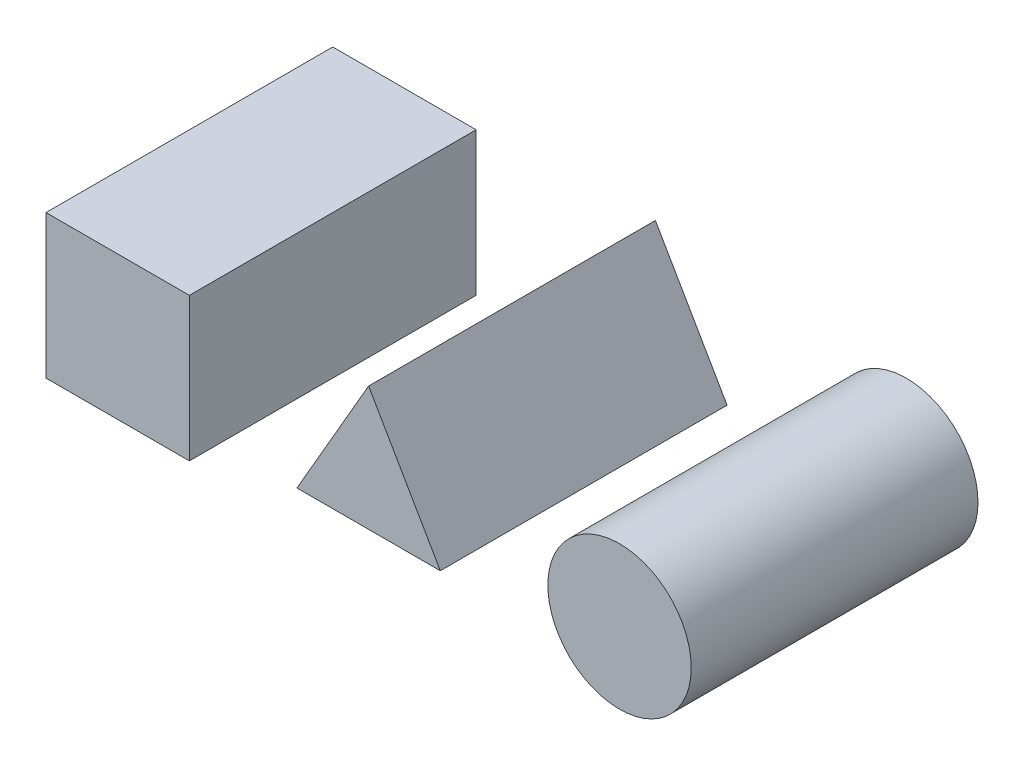
ISO-10303-21;
HEADER;
FILE_DESCRIPTION(('STEP AP214'),'2;1');
FILE_NAME('part.step','',(''),(''),'','','');
FILE_SCHEMA(('AUTOMOTIVE_DESIGN { 1 0 10303 214 1 1 1 1 }'));
ENDSEC;
DATA;
#1=APPLICATION_CONTEXT('core data for automotive mechanical design processes');
#2=APPLICATION_PROTOCOL_DEFINITION('international standard','automotive_design',2000,#1);
#3=PRODUCT_CONTEXT('',#1,'mechanical');
#4=PRODUCT('Part','Part','',(#3));
#5=PRODUCT_RELATED_PRODUCT_CATEGORY('part','',(#4));
#6=PRODUCT_DEFINITION_FORMATION('','',#4);
#7=PRODUCT_DEFINITION_CONTEXT('part definition',#1,'design');
#8=PRODUCT_DEFINITION('design','',#6,#7);
#9=PRODUCT_DEFINITION_SHAPE('','',#8);
#10=(LENGTH_UNIT() NAMED_UNIT(*) SI_UNIT(.MILLI.,.METRE.));
#11=(NAMED_UNIT(*) PLANE_ANGLE_UNIT() SI_UNIT($,.RADIAN.));
#12=(NAMED_UNIT(*) SI_UNIT($,.STERADIAN.) SOLID_ANGLE_UNIT());
#13=UNCERTAINTY_MEASURE_WITH_UNIT(LENGTH_MEASURE(1.E-05),#10,'distance_accuracy_value','');
#14=(GEOMETRIC_REPRESENTATION_CONTEXT(3) GLOBAL_UNCERTAINTY_ASSIGNED_CONTEXT((#13)) GLOBAL_UNIT_ASSIGNED_CONTEXT((#10,
#11,#12)) REPRESENTATION_CONTEXT('',''));
#15=CARTESIAN_POINT('',(0.,0.,0.));
#16=DIRECTION('',(0.,0.,1.));
#17=DIRECTION('',(1.,0.,0.));
#18=AXIS2_PLACEMENT_3D('',#15,#16,#17);
#19=CARTESIAN_POINT('',(70.,0.,80.));
#20=DIRECTION('',(0.,0.,-1.));
#21=DIRECTION('',(-1.,0.,0.));
#22=AXIS2_PLACEMENT_3D('',#19,#20,#21);
#23=CYLINDRICAL_SURFACE('',#22,20.);
#24=CARTESIAN_POINT('',(70.,0.,80.));
#25=DIRECTION('',(0.,0.,1.));
#26=DIRECTION('',(1.,0.,0.));
#27=AXIS2_PLACEMENT_3D('',#24,#25,#26);
#28=CIRCLE('',#27,20.);
#29=CARTESIAN_POINT('',(90.,0.,80.));
#30=VERTEX_POINT('',#29);
#31=EDGE_CURVE('E11',#30,#30,#28,.T.);
#32=ORIENTED_EDGE('',*,*,#31,.F.);
#33=EDGE_LOOP('',(#32));
#34=FACE_BOUND('',#33,.T.);
#35=CARTESIAN_POINT('',(70.,0.,0.));
#36=DIRECTION('',(0.,0.,1.));
#37=DIRECTION('',(1.,0.,0.));
#38=AXIS2_PLACEMENT_3D('',#35,#36,#37);
#39=CIRCLE('',#38,20.);
#40=CARTESIAN_POINT('',(90.,0.,0.));
#41=VERTEX_POINT('',#40);
#42=EDGE_CURVE('E53',#41,#41,#39,.T.);
#43=ORIENTED_EDGE('',*,*,#42,.T.);
#44=EDGE_LOOP('',(#43));
#45=FACE_BOUND('',#44,.T.);
#46=ADVANCED_FACE('F50',(#34,#45),#23,.T.);
#47=CARTESIAN_POINT('',(0.,0.,80.));
#48=DIRECTION('',(0.,0.,1.));
#49=DIRECTION('',(1.,0.,0.));
#50=AXIS2_PLACEMENT_3D('',#47,#48,#49);
#51=PLANE('',#50);
#52=ORIENTED_EDGE('',*,*,#31,.T.);
#53=EDGE_LOOP('',(#52));
#54=FACE_BOUND('',#53,.T.);
#55=ADVANCED_FACE('F65',(#54),#51,.T.);
#56=CARTESIAN_POINT('',(0.,0.,0.));
#57=DIRECTION('',(0.,0.,1.));
#58=DIRECTION('',(1.,0.,0.));
#59=AXIS2_PLACEMENT_3D('',#56,#57,#58);
#60=PLANE('',#59);
#61=ORIENTED_EDGE('',*,*,#42,.F.);
#62=EDGE_LOOP('',(#61));
#63=FACE_BOUND('',#62,.T.);
#64=ADVANCED_FACE('F63',(#63),#60,.F.);
#65=CLOSED_SHELL('',(#46,#55,#64));
#66=MANIFOLD_SOLID_BREP('B2',#65);
#67=CARTESIAN_POINT('',(-50.,0.,80.));
#68=DIRECTION('',(1.,0.,0.));
#69=DIRECTION('',(0.,1.,0.));
#70=AXIS2_PLACEMENT_3D('',#67,#68,#69);
#71=PLANE('',#70);
#72=DIRECTION('',(0.,-1.,0.));
#73=VECTOR('',#72,1.);
#74=CARTESIAN_POINT('',(-50.,0.,0.));
#75=LINE('',#74,#73);
#76=CARTESIAN_POINT('',(-50.,19.9999999999999,0.));
#77=VERTEX_POINT('',#76);
#78=CARTESIAN_POINT('',(-49.9999999999999,-20.0000000000001,0.));
#79=VERTEX_POINT('',#78);
#80=EDGE_CURVE('E169',#77,#79,#75,.T.);
#81=ORIENTED_EDGE('',*,*,#80,.F.);
#82=DIRECTION('',(0.,0.,-1.));
#83=VECTOR('',#82,1.);
#84=CARTESIAN_POINT('',(-50.,19.9999999999999,80.));
#85=LINE('',#84,#83);
#86=CARTESIAN_POINT('',(-50.,19.9999999999999,80.));
#87=VERTEX_POINT('',#86);
#88=EDGE_CURVE('E48',#87,#77,#85,.T.);
#89=ORIENTED_EDGE('',*,*,#88,.F.);
#90=DIRECTION('',(0.,-1.,0.));
#91=VECTOR('',#90,1.);
#92=CARTESIAN_POINT('',(-50.,0.,80.));
#93=LINE('',#92,#91);
#94=CARTESIAN_POINT('',(-49.9999999999999,-20.0000000000001,80.));
#95=VERTEX_POINT('',#94);
#96=EDGE_CURVE('E160',#87,#95,#93,.T.);
#97=ORIENTED_EDGE('',*,*,#96,.T.);
#98=DIRECTION('',(0.,0.,-1.));
#99=VECTOR('',#98,1.);
#100=CARTESIAN_POINT('',(-49.9999999999999,-20.0000000000001,80.));
#101=LINE('',#100,#99);
#102=EDGE_CURVE('E139',#95,#79,#101,.T.);
#103=ORIENTED_EDGE('',*,*,#102,.T.);
#104=EDGE_LOOP('',(#81,#89,#97,#103));
#105=FACE_BOUND('',#104,.T.);
#106=ADVANCED_FACE('F100',(#105),#71,.T.);
#107=CARTESIAN_POINT('',(0.,20.,80.));
#108=DIRECTION('',(0.,1.,0.));
#109=DIRECTION('',(-1.,0.,0.));
#110=AXIS2_PLACEMENT_3D('',#107,#108,#109);
#111=PLANE('',#110);
#112=DIRECTION('',(1.,0.,0.));
#113=VECTOR('',#112,1.);
#114=CARTESIAN_POINT('',(0.,20.,0.));
#115=LINE('',#114,#113);
#116=CARTESIAN_POINT('',(-90.,19.9999999999999,0.));
#117=VERTEX_POINT('',#116);
#118=EDGE_CURVE('E152',#117,#77,#115,.T.);
#119=ORIENTED_EDGE('',*,*,#118,.F.);
#120=DIRECTION('',(0.,0.,-1.));
#121=VECTOR('',#120,1.);
#122=CARTESIAN_POINT('',(-90.,19.9999999999999,80.));
#123=LINE('',#122,#121);
#124=CARTESIAN_POINT('',(-90.,19.9999999999999,80.));
#125=VERTEX_POINT('',#124);
#126=EDGE_CURVE('E109',#125,#117,#123,.T.);
#127=ORIENTED_EDGE('',*,*,#126,.F.);
#128=DIRECTION('',(1.,0.,0.));
#129=VECTOR('',#128,1.);
#130=CARTESIAN_POINT('',(0.,20.,80.));
#131=LINE('',#130,#129);
#132=EDGE_CURVE('E150',#125,#87,#131,.T.);
#133=ORIENTED_EDGE('',*,*,#132,.T.);
#134=ORIENTED_EDGE('',*,*,#88,.T.);
#135=EDGE_LOOP('',(#119,#127,#133,#134));
#136=FACE_BOUND('',#135,.T.);
#137=ADVANCED_FACE('F148',(#136),#111,.T.);
#138=CARTESIAN_POINT('',(-90.,0.,80.));
#139=DIRECTION('',(1.,0.,0.));
#140=DIRECTION('',(0.,1.,0.));
#141=AXIS2_PLACEMENT_3D('',#138,#139,#140);
#142=PLANE('',#141);
#143=DIRECTION('',(0.,-1.,0.));
#144=VECTOR('',#143,1.);
#145=CARTESIAN_POINT('',(-90.,0.,0.));
#146=LINE('',#145,#144);
#147=CARTESIAN_POINT('',(-89.9999999999999,-20.0000000000001,0.));
#148=VERTEX_POINT('',#147);
#149=EDGE_CURVE('E132',#117,#148,#146,.T.);
#150=ORIENTED_EDGE('',*,*,#149,.T.);
#151=DIRECTION('',(0.,0.,-1.));
#152=VECTOR('',#151,1.);
#153=CARTESIAN_POINT('',(-89.9999999999999,-20.0000000000001,80.));
#154=LINE('',#153,#152);
#155=CARTESIAN_POINT('',(-89.9999999999999,-20.0000000000001,80.));
#156=VERTEX_POINT('',#155);
#157=EDGE_CURVE('E154',#156,#148,#154,.T.);
#158=ORIENTED_EDGE('',*,*,#157,.F.);
#159=DIRECTION('',(0.,-1.,0.));
#160=VECTOR('',#159,1.);
#161=CARTESIAN_POINT('',(-90.,0.,80.));
#162=LINE('',#161,#160);
#163=EDGE_CURVE('E155',#125,#156,#162,.T.);
#164=ORIENTED_EDGE('',*,*,#163,.F.);
#165=ORIENTED_EDGE('',*,*,#126,.T.);
#166=EDGE_LOOP('',(#150,#158,#164,#165));
#167=FACE_BOUND('',#166,.T.);
#168=ADVANCED_FACE('F156',(#167),#142,.F.);
#169=CARTESIAN_POINT('',(0.,-20.,80.));
#170=DIRECTION('',(0.,1.,0.));
#171=DIRECTION('',(-1.,0.,0.));
#172=AXIS2_PLACEMENT_3D('',#169,#170,#171);
#173=PLANE('',#172);
#174=DIRECTION('',(1.,0.,0.));
#175=VECTOR('',#174,1.);
#176=CARTESIAN_POINT('',(0.,-20.,0.));
#177=LINE('',#176,#175);
#178=EDGE_CURVE('E164',#148,#79,#177,.T.);
#179=ORIENTED_EDGE('',*,*,#178,.T.);
#180=ORIENTED_EDGE('',*,*,#102,.F.);
#181=DIRECTION('',(1.,0.,0.));
#182=VECTOR('',#181,1.);
#183=CARTESIAN_POINT('',(0.,-20.,80.));
#184=LINE('',#183,#182);
#185=EDGE_CURVE('E117',#156,#95,#184,.T.);
#186=ORIENTED_EDGE('',*,*,#185,.F.);
#187=ORIENTED_EDGE('',*,*,#157,.T.);
#188=EDGE_LOOP('',(#179,#180,#186,#187));
#189=FACE_BOUND('',#188,.T.);
#190=ADVANCED_FACE('F184',(#189),#173,.F.);
#191=CARTESIAN_POINT('',(0.,0.,80.));
#192=DIRECTION('',(0.,0.,1.));
#193=DIRECTION('',(1.,0.,0.));
#194=AXIS2_PLACEMENT_3D('',#191,#192,#193);
#195=PLANE('',#194);
#196=ORIENTED_EDGE('',*,*,#96,.F.);
#197=ORIENTED_EDGE('',*,*,#132,.F.);
#198=ORIENTED_EDGE('',*,*,#163,.T.);
#199=ORIENTED_EDGE('',*,*,#185,.T.);
#200=EDGE_LOOP('',(#196,#197,#198,#199));
#201=FACE_BOUND('',#200,.T.);
#202=ADVANCED_FACE('F159',(#201),#195,.T.);
#203=CARTESIAN_POINT('',(0.,0.,0.));
#204=DIRECTION('',(0.,0.,1.));
#205=DIRECTION('',(1.,0.,0.));
#206=AXIS2_PLACEMENT_3D('',#203,#204,#205);
#207=PLANE('',#206);
#208=ORIENTED_EDGE('',*,*,#80,.T.);
#209=ORIENTED_EDGE('',*,*,#178,.F.);
#210=ORIENTED_EDGE('',*,*,#149,.F.);
#211=ORIENTED_EDGE('',*,*,#118,.T.);
#212=EDGE_LOOP('',(#208,#209,#210,#211));
#213=FACE_BOUND('',#212,.T.);
#214=ADVANCED_FACE('F186',(#213),#207,.F.);
#215=CLOSED_SHELL('',(#106,#137,#168,#190,#202,#214));
#216=MANIFOLD_SOLID_BREP('B6',#215);
#217=CARTESIAN_POINT('',(0.,-11.5470053837926,80.));
#218=DIRECTION('',(0.,-1.,0.));
#219=DIRECTION('',(1.,0.,0.));
#220=AXIS2_PLACEMENT_3D('',#217,#218,#219);
#221=PLANE('',#220);
#222=DIRECTION('',(-1.,0.,0.));
#223=VECTOR('',#222,1.);
#224=CARTESIAN_POINT('',(0.,-11.5470053837926,0.));
#225=LINE('',#224,#223);
#226=CARTESIAN_POINT('',(20.,-11.5470053837926,0.));
#227=VERTEX_POINT('',#226);
#228=CARTESIAN_POINT('',(-20.,-11.5470053837926,0.));
#229=VERTEX_POINT('',#228);
#230=EDGE_CURVE('E270',#227,#229,#225,.T.);
#231=ORIENTED_EDGE('',*,*,#230,.F.);
#232=DIRECTION('',(0.,0.,-1.));
#233=VECTOR('',#232,1.);
#234=CARTESIAN_POINT('',(20.,-11.5470053837926,80.));
#235=LINE('',#234,#233);
#236=CARTESIAN_POINT('',(20.,-11.5470053837926,80.));
#237=VERTEX_POINT('',#236);
#238=EDGE_CURVE('E98',#237,#227,#235,.T.);
#239=ORIENTED_EDGE('',*,*,#238,.F.);
#240=DIRECTION('',(-1.,0.,0.));
#241=VECTOR('',#240,1.);
#242=CARTESIAN_POINT('',(0.,-11.5470053837926,80.));
#243=LINE('',#242,#241);
#244=CARTESIAN_POINT('',(-20.,-11.5470053837926,80.));
#245=VERTEX_POINT('',#244);
#246=EDGE_CURVE('E268',#237,#245,#243,.T.);
#247=ORIENTED_EDGE('',*,*,#246,.T.);
#248=DIRECTION('',(0.,0.,-1.));
#249=VECTOR('',#248,1.);
#250=CARTESIAN_POINT('',(-20.,-11.5470053837926,80.));
#251=LINE('',#250,#249);
#252=EDGE_CURVE('E252',#245,#229,#251,.T.);
#253=ORIENTED_EDGE('',*,*,#252,.T.);
#254=EDGE_LOOP('',(#231,#239,#247,#253));
#255=FACE_BOUND('',#254,.T.);
#256=ADVANCED_FACE('F236',(#255),#221,.T.);
#257=CARTESIAN_POINT('',(9.99999999999998,5.77350269189625,80.));
#258=DIRECTION('',(0.866025403784438,0.5,0.));
#259=DIRECTION('',(-0.5,0.866025403784439,0.));
#260=AXIS2_PLACEMENT_3D('',#257,#258,#259);
#261=PLANE('',#260);
#262=DIRECTION('',(0.5,-0.866025403784439,0.));
#263=VECTOR('',#262,1.);
#264=CARTESIAN_POINT('',(9.99999999999998,5.77350269189625,0.));
#265=LINE('',#264,#263);
#266=CARTESIAN_POINT('',(0.,23.094010767585,0.));
#267=VERTEX_POINT('',#266);
#268=EDGE_CURVE('E286',#267,#227,#265,.T.);
#269=ORIENTED_EDGE('',*,*,#268,.F.);
#270=DIRECTION('',(0.,0.,-1.));
#271=VECTOR('',#270,1.);
#272=CARTESIAN_POINT('',(0.,23.094010767585,80.));
#273=LINE('',#272,#271);
#274=CARTESIAN_POINT('',(0.,23.094010767585,80.));
#275=VERTEX_POINT('',#274);
#276=EDGE_CURVE('E244',#275,#267,#273,.T.);
#277=ORIENTED_EDGE('',*,*,#276,.F.);
#278=DIRECTION('',(0.5,-0.866025403784439,0.));
#279=VECTOR('',#278,1.);
#280=CARTESIAN_POINT('',(9.99999999999998,5.77350269189625,80.));
#281=LINE('',#280,#279);
#282=EDGE_CURVE('E277',#275,#237,#281,.T.);
#283=ORIENTED_EDGE('',*,*,#282,.T.);
#284=ORIENTED_EDGE('',*,*,#238,.T.);
#285=EDGE_LOOP('',(#269,#277,#283,#284));
#286=FACE_BOUND('',#285,.T.);
#287=ADVANCED_FACE('F281',(#286),#261,.T.);
#288=CARTESIAN_POINT('',(-9.99999999999999,5.77350269189624,80.));
#289=DIRECTION('',(-0.866025403784439,0.499999999999999,0.));
#290=DIRECTION('',(-0.499999999999999,-0.866025403784439,0.));
#291=AXIS2_PLACEMENT_3D('',#288,#289,#290);
#292=PLANE('',#291);
#293=DIRECTION('',(0.499999999999999,0.866025403784439,0.));
#294=VECTOR('',#293,1.);
#295=CARTESIAN_POINT('',(-9.99999999999999,5.77350269189624,0.));
#296=LINE('',#295,#294);
#297=EDGE_CURVE('E279',#229,#267,#296,.T.);
#298=ORIENTED_EDGE('',*,*,#297,.F.);
#299=ORIENTED_EDGE('',*,*,#252,.F.);
#300=DIRECTION('',(0.499999999999999,0.866025403784439,0.));
#301=VECTOR('',#300,1.);
#302=CARTESIAN_POINT('',(-9.99999999999999,5.77350269189624,80.));
#303=LINE('',#302,#301);
#304=EDGE_CURVE('E278',#245,#275,#303,.T.);
#305=ORIENTED_EDGE('',*,*,#304,.T.);
#306=ORIENTED_EDGE('',*,*,#276,.T.);
#307=EDGE_LOOP('',(#298,#299,#305,#306));
#308=FACE_BOUND('',#307,.T.);
#309=ADVANCED_FACE('F292',(#308),#292,.T.);
#310=CARTESIAN_POINT('',(0.,0.,80.));
#311=DIRECTION('',(0.,0.,1.));
#312=DIRECTION('',(1.,0.,0.));
#313=AXIS2_PLACEMENT_3D('',#310,#311,#312);
#314=PLANE('',#313);
#315=ORIENTED_EDGE('',*,*,#246,.F.);
#316=ORIENTED_EDGE('',*,*,#282,.F.);
#317=ORIENTED_EDGE('',*,*,#304,.F.);
#318=EDGE_LOOP('',(#315,#316,#317));
#319=FACE_BOUND('',#318,.T.);
#320=ADVANCED_FACE('F276',(#319),#314,.T.);
#321=CARTESIAN_POINT('',(0.,0.,0.));
#322=DIRECTION('',(0.,0.,1.));
#323=DIRECTION('',(1.,0.,0.));
#324=AXIS2_PLACEMENT_3D('',#321,#322,#323);
#325=PLANE('',#324);
#326=ORIENTED_EDGE('',*,*,#230,.T.);
#327=ORIENTED_EDGE('',*,*,#297,.T.);
#328=ORIENTED_EDGE('',*,*,#268,.T.);
#329=EDGE_LOOP('',(#326,#327,#328));
#330=FACE_BOUND('',#329,.T.);
#331=ADVANCED_FACE('F291',(#330),#325,.F.);
#332=CLOSED_SHELL('',(#256,#287,#309,#320,#331));
#333=MANIFOLD_SOLID_BREP('B42',#332);
#334=ADVANCED_BREP_SHAPE_REPRESENTATION('',(#18,#66,#216,#333),#14);
#335=SHAPE_DEFINITION_REPRESENTATION(#9,#334);
ENDSEC;
END-ISO-10303-21;
